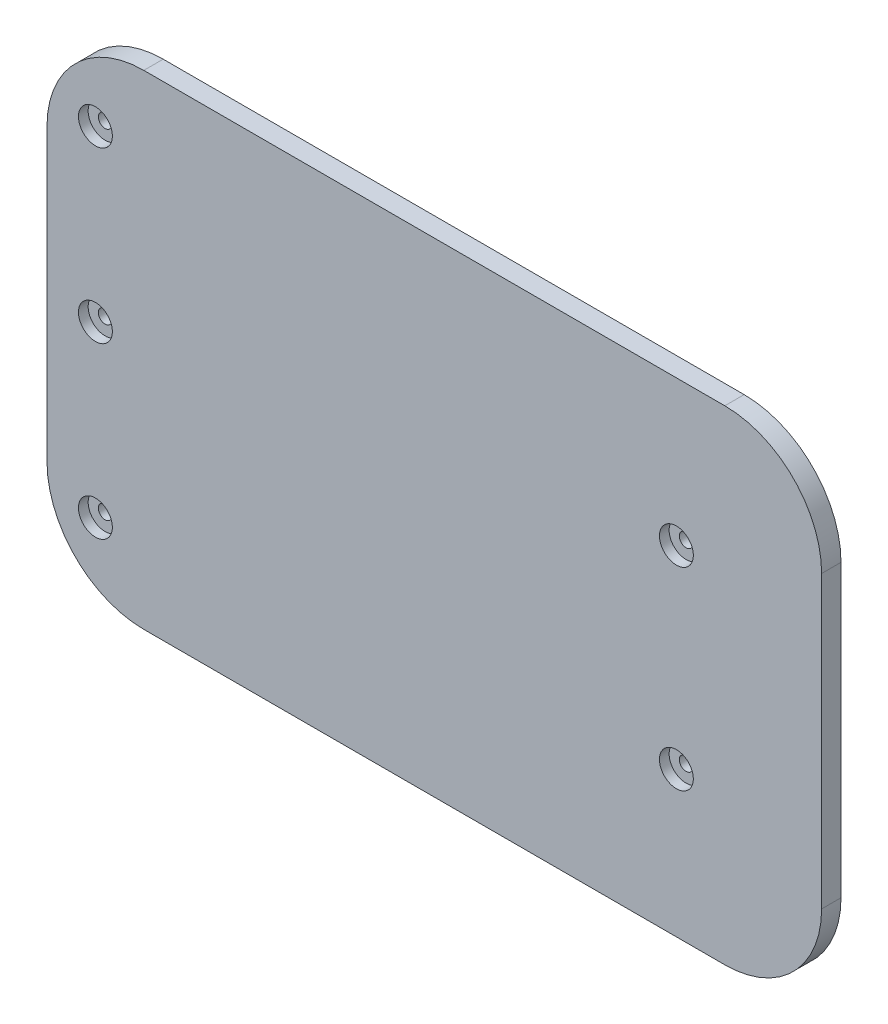
ISO-10303-21;
HEADER;
FILE_DESCRIPTION(('STEP AP214'),'2;1');
FILE_NAME('part.step','',(''),(''),'','','');
FILE_SCHEMA(('AUTOMOTIVE_DESIGN { 1 0 10303 214 1 1 1 1 }'));
ENDSEC;
DATA;
#1=APPLICATION_CONTEXT('core data for automotive mechanical design processes');
#2=APPLICATION_PROTOCOL_DEFINITION('international standard','automotive_design',2000,#1);
#3=PRODUCT_CONTEXT('',#1,'mechanical');
#4=PRODUCT('Part','Part','',(#3));
#5=PRODUCT_RELATED_PRODUCT_CATEGORY('part','',(#4));
#6=PRODUCT_DEFINITION_FORMATION('','',#4);
#7=PRODUCT_DEFINITION_CONTEXT('part definition',#1,'design');
#8=PRODUCT_DEFINITION('design','',#6,#7);
#9=PRODUCT_DEFINITION_SHAPE('','',#8);
#10=(LENGTH_UNIT() NAMED_UNIT(*) SI_UNIT(.MILLI.,.METRE.));
#11=(NAMED_UNIT(*) PLANE_ANGLE_UNIT() SI_UNIT($,.RADIAN.));
#12=(NAMED_UNIT(*) SI_UNIT($,.STERADIAN.) SOLID_ANGLE_UNIT());
#13=UNCERTAINTY_MEASURE_WITH_UNIT(LENGTH_MEASURE(1.E-05),#10,'distance_accuracy_value','');
#14=(GEOMETRIC_REPRESENTATION_CONTEXT(3) GLOBAL_UNCERTAINTY_ASSIGNED_CONTEXT((#13)) GLOBAL_UNIT_ASSIGNED_CONTEXT((#10,
#11,#12)) REPRESENTATION_CONTEXT('',''));
#15=CARTESIAN_POINT('',(0.,0.,0.));
#16=DIRECTION('',(0.,0.,1.));
#17=DIRECTION('',(1.,0.,0.));
#18=AXIS2_PLACEMENT_3D('',#15,#16,#17);
#19=CARTESIAN_POINT('',(130.,30.,0.));
#20=DIRECTION('',(0.,0.,1.));
#21=DIRECTION('',(1.,0.,0.));
#22=AXIS2_PLACEMENT_3D('',#19,#20,#21);
#23=CYLINDRICAL_SURFACE('',#22,1.4);
#24=CARTESIAN_POINT('',(130.,30.,0.));
#25=DIRECTION('',(0.,0.,1.));
#26=DIRECTION('',(1.,0.,0.));
#27=AXIS2_PLACEMENT_3D('',#24,#25,#26);
#28=CIRCLE('',#27,1.4);
#29=CARTESIAN_POINT('',(131.4,30.,0.));
#30=VERTEX_POINT('',#29);
#31=EDGE_CURVE('E133',#30,#30,#28,.T.);
#32=ORIENTED_EDGE('',*,*,#31,.F.);
#33=EDGE_LOOP('',(#32));
#34=FACE_BOUND('',#33,.T.);
#35=CARTESIAN_POINT('',(130.,30.,2.));
#36=DIRECTION('',(0.,0.,1.));
#37=DIRECTION('',(1.,0.,0.));
#38=AXIS2_PLACEMENT_3D('',#35,#36,#37);
#39=CIRCLE('',#38,1.4);
#40=CARTESIAN_POINT('',(131.4,30.,2.));
#41=VERTEX_POINT('',#40);
#42=EDGE_CURVE('E37',#41,#41,#39,.F.);
#43=ORIENTED_EDGE('',*,*,#42,.F.);
#44=EDGE_LOOP('',(#43));
#45=FACE_BOUND('',#44,.T.);
#46=ADVANCED_FACE('F33',(#34,#45),#23,.F.);
#47=CARTESIAN_POINT('',(10.,85.,0.));
#48=DIRECTION('',(0.,0.,1.));
#49=DIRECTION('',(1.,0.,0.));
#50=AXIS2_PLACEMENT_3D('',#47,#48,#49);
#51=CYLINDRICAL_SURFACE('',#50,1.4);
#52=CARTESIAN_POINT('',(10.,85.,0.));
#53=DIRECTION('',(0.,0.,1.));
#54=DIRECTION('',(1.,0.,0.));
#55=AXIS2_PLACEMENT_3D('',#52,#53,#54);
#56=CIRCLE('',#55,1.4);
#57=CARTESIAN_POINT('',(11.4,85.,0.));
#58=VERTEX_POINT('',#57);
#59=EDGE_CURVE('E175',#58,#58,#56,.T.);
#60=ORIENTED_EDGE('',*,*,#59,.F.);
#61=EDGE_LOOP('',(#60));
#62=FACE_BOUND('',#61,.T.);
#63=CARTESIAN_POINT('',(10.,85.,2.));
#64=DIRECTION('',(0.,0.,1.));
#65=DIRECTION('',(1.,0.,0.));
#66=AXIS2_PLACEMENT_3D('',#63,#64,#65);
#67=CIRCLE('',#66,1.4);
#68=CARTESIAN_POINT('',(11.4,85.,2.));
#69=VERTEX_POINT('',#68);
#70=EDGE_CURVE('E170',#69,#69,#67,.F.);
#71=ORIENTED_EDGE('',*,*,#70,.F.);
#72=EDGE_LOOP('',(#71));
#73=FACE_BOUND('',#72,.T.);
#74=ADVANCED_FACE('F227',(#62,#73),#51,.F.);
#75=CARTESIAN_POINT('',(10.,50.,0.));
#76=DIRECTION('',(0.,0.,1.));
#77=DIRECTION('',(1.,0.,0.));
#78=AXIS2_PLACEMENT_3D('',#75,#76,#77);
#79=CYLINDRICAL_SURFACE('',#78,1.4);
#80=CARTESIAN_POINT('',(10.,50.,0.));
#81=DIRECTION('',(0.,0.,1.));
#82=DIRECTION('',(1.,0.,0.));
#83=AXIS2_PLACEMENT_3D('',#80,#81,#82);
#84=CIRCLE('',#83,1.4);
#85=CARTESIAN_POINT('',(11.4,50.,0.));
#86=VERTEX_POINT('',#85);
#87=EDGE_CURVE('E179',#86,#86,#84,.T.);
#88=ORIENTED_EDGE('',*,*,#87,.F.);
#89=EDGE_LOOP('',(#88));
#90=FACE_BOUND('',#89,.T.);
#91=CARTESIAN_POINT('',(10.,50.,2.));
#92=DIRECTION('',(0.,0.,1.));
#93=DIRECTION('',(1.,0.,0.));
#94=AXIS2_PLACEMENT_3D('',#91,#92,#93);
#95=CIRCLE('',#94,1.4);
#96=CARTESIAN_POINT('',(11.4,50.,2.));
#97=VERTEX_POINT('',#96);
#98=EDGE_CURVE('E168',#97,#97,#95,.F.);
#99=ORIENTED_EDGE('',*,*,#98,.F.);
#100=EDGE_LOOP('',(#99));
#101=FACE_BOUND('',#100,.T.);
#102=ADVANCED_FACE('F233',(#90,#101),#79,.F.);
#103=CARTESIAN_POINT('',(10.,15.,0.));
#104=DIRECTION('',(0.,0.,1.));
#105=DIRECTION('',(1.,0.,0.));
#106=AXIS2_PLACEMENT_3D('',#103,#104,#105);
#107=CYLINDRICAL_SURFACE('',#106,1.4);
#108=CARTESIAN_POINT('',(10.,15.,0.));
#109=DIRECTION('',(0.,0.,1.));
#110=DIRECTION('',(1.,0.,0.));
#111=AXIS2_PLACEMENT_3D('',#108,#109,#110);
#112=CIRCLE('',#111,1.4);
#113=CARTESIAN_POINT('',(11.4,15.,0.));
#114=VERTEX_POINT('',#113);
#115=EDGE_CURVE('E184',#114,#114,#112,.T.);
#116=ORIENTED_EDGE('',*,*,#115,.F.);
#117=EDGE_LOOP('',(#116));
#118=FACE_BOUND('',#117,.T.);
#119=CARTESIAN_POINT('',(10.,15.,2.));
#120=DIRECTION('',(0.,0.,1.));
#121=DIRECTION('',(1.,0.,0.));
#122=AXIS2_PLACEMENT_3D('',#119,#120,#121);
#123=CIRCLE('',#122,1.4);
#124=CARTESIAN_POINT('',(11.4,15.,2.));
#125=VERTEX_POINT('',#124);
#126=EDGE_CURVE('E164',#125,#125,#123,.F.);
#127=ORIENTED_EDGE('',*,*,#126,.F.);
#128=EDGE_LOOP('',(#127));
#129=FACE_BOUND('',#128,.T.);
#130=ADVANCED_FACE('F240',(#118,#129),#107,.F.);
#131=CARTESIAN_POINT('',(130.,70.,0.));
#132=DIRECTION('',(0.,0.,1.));
#133=DIRECTION('',(1.,0.,0.));
#134=AXIS2_PLACEMENT_3D('',#131,#132,#133);
#135=CYLINDRICAL_SURFACE('',#134,1.4);
#136=CARTESIAN_POINT('',(130.,70.,0.));
#137=DIRECTION('',(0.,0.,1.));
#138=DIRECTION('',(1.,0.,0.));
#139=AXIS2_PLACEMENT_3D('',#136,#137,#138);
#140=CIRCLE('',#139,1.4);
#141=CARTESIAN_POINT('',(131.4,70.,0.));
#142=VERTEX_POINT('',#141);
#143=EDGE_CURVE('E188',#142,#142,#140,.T.);
#144=ORIENTED_EDGE('',*,*,#143,.F.);
#145=EDGE_LOOP('',(#144));
#146=FACE_BOUND('',#145,.T.);
#147=CARTESIAN_POINT('',(130.,70.,2.));
#148=DIRECTION('',(0.,0.,1.));
#149=DIRECTION('',(1.,0.,0.));
#150=AXIS2_PLACEMENT_3D('',#147,#148,#149);
#151=CIRCLE('',#150,1.4);
#152=CARTESIAN_POINT('',(131.4,70.,2.));
#153=VERTEX_POINT('',#152);
#154=EDGE_CURVE('E161',#153,#153,#151,.F.);
#155=ORIENTED_EDGE('',*,*,#154,.F.);
#156=EDGE_LOOP('',(#155));
#157=FACE_BOUND('',#156,.T.);
#158=ADVANCED_FACE('F255',(#146,#157),#135,.F.);
#159=CARTESIAN_POINT('',(0.,0.,4.));
#160=DIRECTION('',(1.,0.,0.));
#161=DIRECTION('',(0.,0.,-1.));
#162=AXIS2_PLACEMENT_3D('',#159,#160,#161);
#163=PLANE('',#162);
#164=DIRECTION('',(0.,-1.,0.));
#165=VECTOR('',#164,1.);
#166=CARTESIAN_POINT('',(0.,0.,0.));
#167=LINE('',#166,#165);
#168=CARTESIAN_POINT('',(0.,80.,0.));
#169=VERTEX_POINT('',#168);
#170=CARTESIAN_POINT('',(0.,20.,0.));
#171=VERTEX_POINT('',#170);
#172=EDGE_CURVE('E128',#169,#171,#167,.T.);
#173=ORIENTED_EDGE('',*,*,#172,.T.);
#174=DIRECTION('',(0.,0.,-1.));
#175=VECTOR('',#174,1.);
#176=CARTESIAN_POINT('',(0.,20.,4.));
#177=LINE('',#176,#175);
#178=CARTESIAN_POINT('',(0.,20.,4.));
#179=VERTEX_POINT('',#178);
#180=EDGE_CURVE('E106',#171,#179,#177,.F.);
#181=ORIENTED_EDGE('',*,*,#180,.T.);
#182=DIRECTION('',(0.,-1.,0.));
#183=VECTOR('',#182,1.);
#184=CARTESIAN_POINT('',(0.,0.,4.));
#185=LINE('',#184,#183);
#186=CARTESIAN_POINT('',(0.,80.,4.));
#187=VERTEX_POINT('',#186);
#188=EDGE_CURVE('E138',#187,#179,#185,.T.);
#189=ORIENTED_EDGE('',*,*,#188,.F.);
#190=DIRECTION('',(0.,0.,-1.));
#191=VECTOR('',#190,1.);
#192=CARTESIAN_POINT('',(0.,80.,4.));
#193=LINE('',#192,#191);
#194=EDGE_CURVE('E111',#187,#169,#193,.T.);
#195=ORIENTED_EDGE('',*,*,#194,.T.);
#196=EDGE_LOOP('',(#173,#181,#189,#195));
#197=FACE_BOUND('',#196,.T.);
#198=ADVANCED_FACE('F206',(#197),#163,.F.);
#199=CARTESIAN_POINT('',(0.,0.,4.));
#200=DIRECTION('',(0.,1.,0.));
#201=DIRECTION('',(0.,0.,1.));
#202=AXIS2_PLACEMENT_3D('',#199,#200,#201);
#203=PLANE('',#202);
#204=DIRECTION('',(1.,0.,0.));
#205=VECTOR('',#204,1.);
#206=CARTESIAN_POINT('',(0.,0.,4.));
#207=LINE('',#206,#205);
#208=CARTESIAN_POINT('',(20.,0.,4.));
#209=VERTEX_POINT('',#208);
#210=CARTESIAN_POINT('',(140.,0.,4.));
#211=VERTEX_POINT('',#210);
#212=EDGE_CURVE('E121',#209,#211,#207,.T.);
#213=ORIENTED_EDGE('',*,*,#212,.F.);
#214=DIRECTION('',(0.,0.,-1.));
#215=VECTOR('',#214,1.);
#216=CARTESIAN_POINT('',(20.,0.,4.));
#217=LINE('',#216,#215);
#218=CARTESIAN_POINT('',(20.,0.,0.));
#219=VERTEX_POINT('',#218);
#220=EDGE_CURVE('E105',#209,#219,#217,.T.);
#221=ORIENTED_EDGE('',*,*,#220,.T.);
#222=DIRECTION('',(1.,0.,0.));
#223=VECTOR('',#222,1.);
#224=CARTESIAN_POINT('',(0.,0.,0.));
#225=LINE('',#224,#223);
#226=CARTESIAN_POINT('',(140.,0.,0.));
#227=VERTEX_POINT('',#226);
#228=EDGE_CURVE('E118',#219,#227,#225,.T.);
#229=ORIENTED_EDGE('',*,*,#228,.T.);
#230=DIRECTION('',(0.,0.,-1.));
#231=VECTOR('',#230,1.);
#232=CARTESIAN_POINT('',(140.,0.,4.));
#233=LINE('',#232,#231);
#234=EDGE_CURVE('E123',#227,#211,#233,.F.);
#235=ORIENTED_EDGE('',*,*,#234,.T.);
#236=EDGE_LOOP('',(#213,#221,#229,#235));
#237=FACE_BOUND('',#236,.T.);
#238=ADVANCED_FACE('F117',(#237),#203,.F.);
#239=CARTESIAN_POINT('',(160.,0.,4.));
#240=DIRECTION('',(-1.,0.,0.));
#241=DIRECTION('',(0.,0.,1.));
#242=AXIS2_PLACEMENT_3D('',#239,#240,#241);
#243=PLANE('',#242);
#244=DIRECTION('',(0.,1.,0.));
#245=VECTOR('',#244,1.);
#246=CARTESIAN_POINT('',(160.,0.,4.));
#247=LINE('',#246,#245);
#248=CARTESIAN_POINT('',(160.,20.,4.));
#249=VERTEX_POINT('',#248);
#250=CARTESIAN_POINT('',(160.,80.,4.));
#251=VERTEX_POINT('',#250);
#252=EDGE_CURVE('E198',#249,#251,#247,.T.);
#253=ORIENTED_EDGE('',*,*,#252,.F.);
#254=DIRECTION('',(0.,0.,-1.));
#255=VECTOR('',#254,1.);
#256=CARTESIAN_POINT('',(160.,20.,4.));
#257=LINE('',#256,#255);
#258=CARTESIAN_POINT('',(160.,20.,0.));
#259=VERTEX_POINT('',#258);
#260=EDGE_CURVE('E157',#249,#259,#257,.T.);
#261=ORIENTED_EDGE('',*,*,#260,.T.);
#262=DIRECTION('',(0.,1.,0.));
#263=VECTOR('',#262,1.);
#264=CARTESIAN_POINT('',(160.,0.,0.));
#265=LINE('',#264,#263);
#266=CARTESIAN_POINT('',(160.,80.,0.));
#267=VERTEX_POINT('',#266);
#268=EDGE_CURVE('E127',#259,#267,#265,.T.);
#269=ORIENTED_EDGE('',*,*,#268,.T.);
#270=DIRECTION('',(0.,0.,-1.));
#271=VECTOR('',#270,1.);
#272=CARTESIAN_POINT('',(160.,80.,4.));
#273=LINE('',#272,#271);
#274=EDGE_CURVE('E155',#267,#251,#273,.F.);
#275=ORIENTED_EDGE('',*,*,#274,.T.);
#276=EDGE_LOOP('',(#253,#261,#269,#275));
#277=FACE_BOUND('',#276,.T.);
#278=ADVANCED_FACE('F214',(#277),#243,.F.);
#279=CARTESIAN_POINT('',(0.,100.,4.));
#280=DIRECTION('',(0.,-1.,0.));
#281=DIRECTION('',(0.,0.,-1.));
#282=AXIS2_PLACEMENT_3D('',#279,#280,#281);
#283=PLANE('',#282);
#284=DIRECTION('',(-1.,0.,0.));
#285=VECTOR('',#284,1.);
#286=CARTESIAN_POINT('',(0.,100.,4.));
#287=LINE('',#286,#285);
#288=CARTESIAN_POINT('',(140.,100.,4.));
#289=VERTEX_POINT('',#288);
#290=CARTESIAN_POINT('',(20.,100.,4.));
#291=VERTEX_POINT('',#290);
#292=EDGE_CURVE('E139',#289,#291,#287,.T.);
#293=ORIENTED_EDGE('',*,*,#292,.F.);
#294=DIRECTION('',(0.,0.,-1.));
#295=VECTOR('',#294,1.);
#296=CARTESIAN_POINT('',(140.,100.,4.));
#297=LINE('',#296,#295);
#298=CARTESIAN_POINT('',(140.,100.,0.));
#299=VERTEX_POINT('',#298);
#300=EDGE_CURVE('E11',#289,#299,#297,.T.);
#301=ORIENTED_EDGE('',*,*,#300,.T.);
#302=DIRECTION('',(-1.,0.,0.));
#303=VECTOR('',#302,1.);
#304=CARTESIAN_POINT('',(0.,100.,0.));
#305=LINE('',#304,#303);
#306=CARTESIAN_POINT('',(20.,100.,0.));
#307=VERTEX_POINT('',#306);
#308=EDGE_CURVE('E131',#299,#307,#305,.T.);
#309=ORIENTED_EDGE('',*,*,#308,.T.);
#310=DIRECTION('',(0.,0.,-1.));
#311=VECTOR('',#310,1.);
#312=CARTESIAN_POINT('',(20.,100.,4.));
#313=LINE('',#312,#311);
#314=EDGE_CURVE('E42',#307,#291,#313,.F.);
#315=ORIENTED_EDGE('',*,*,#314,.T.);
#316=EDGE_LOOP('',(#293,#301,#309,#315));
#317=FACE_BOUND('',#316,.T.);
#318=ADVANCED_FACE('F208',(#317),#283,.F.);
#319=CARTESIAN_POINT('',(0.,0.,4.));
#320=DIRECTION('',(0.,0.,-1.));
#321=DIRECTION('',(-1.,0.,0.));
#322=AXIS2_PLACEMENT_3D('',#319,#320,#321);
#323=PLANE('',#322);
#324=CARTESIAN_POINT('',(10.,15.,4.));
#325=DIRECTION('',(0.,0.,1.));
#326=DIRECTION('',(1.,0.,0.));
#327=AXIS2_PLACEMENT_3D('',#324,#325,#326);
#328=CIRCLE('',#327,3.5);
#329=CARTESIAN_POINT('',(13.5,15.,4.));
#330=VERTEX_POINT('',#329);
#331=EDGE_CURVE('E339',#330,#330,#328,.T.);
#332=ORIENTED_EDGE('',*,*,#331,.F.);
#333=EDGE_LOOP('',(#332));
#334=FACE_BOUND('',#333,.T.);
#335=CARTESIAN_POINT('',(10.,50.,4.));
#336=DIRECTION('',(0.,0.,1.));
#337=DIRECTION('',(1.,0.,0.));
#338=AXIS2_PLACEMENT_3D('',#335,#336,#337);
#339=CIRCLE('',#338,3.5);
#340=CARTESIAN_POINT('',(13.5,50.,4.));
#341=VERTEX_POINT('',#340);
#342=EDGE_CURVE('E333',#341,#341,#339,.T.);
#343=ORIENTED_EDGE('',*,*,#342,.F.);
#344=EDGE_LOOP('',(#343));
#345=FACE_BOUND('',#344,.T.);
#346=CARTESIAN_POINT('',(10.,85.,4.));
#347=DIRECTION('',(0.,0.,1.));
#348=DIRECTION('',(1.,0.,0.));
#349=AXIS2_PLACEMENT_3D('',#346,#347,#348);
#350=CIRCLE('',#349,3.5);
#351=CARTESIAN_POINT('',(13.5,85.,4.));
#352=VERTEX_POINT('',#351);
#353=EDGE_CURVE('E327',#352,#352,#350,.T.);
#354=ORIENTED_EDGE('',*,*,#353,.F.);
#355=EDGE_LOOP('',(#354));
#356=FACE_BOUND('',#355,.T.);
#357=CARTESIAN_POINT('',(130.,70.,4.));
#358=DIRECTION('',(0.,0.,1.));
#359=DIRECTION('',(1.,0.,0.));
#360=AXIS2_PLACEMENT_3D('',#357,#358,#359);
#361=CIRCLE('',#360,3.49999999999999);
#362=CARTESIAN_POINT('',(133.5,70.,4.));
#363=VERTEX_POINT('',#362);
#364=EDGE_CURVE('E318',#363,#363,#361,.T.);
#365=ORIENTED_EDGE('',*,*,#364,.F.);
#366=EDGE_LOOP('',(#365));
#367=FACE_BOUND('',#366,.T.);
#368=CARTESIAN_POINT('',(130.,30.,4.));
#369=DIRECTION('',(0.,0.,1.));
#370=DIRECTION('',(1.,0.,0.));
#371=AXIS2_PLACEMENT_3D('',#368,#369,#370);
#372=CIRCLE('',#371,3.49999999999999);
#373=CARTESIAN_POINT('',(133.5,30.,4.));
#374=VERTEX_POINT('',#373);
#375=EDGE_CURVE('E317',#374,#374,#372,.T.);
#376=ORIENTED_EDGE('',*,*,#375,.F.);
#377=EDGE_LOOP('',(#376));
#378=FACE_BOUND('',#377,.T.);
#379=ORIENTED_EDGE('',*,*,#188,.T.);
#380=CARTESIAN_POINT('',(20.,20.,4.));
#381=DIRECTION('',(0.,0.,-1.));
#382=DIRECTION('',(-1.,0.,0.));
#383=AXIS2_PLACEMENT_3D('',#380,#381,#382);
#384=CIRCLE('',#383,20.);
#385=EDGE_CURVE('E153',#179,#209,#384,.F.);
#386=ORIENTED_EDGE('',*,*,#385,.T.);
#387=ORIENTED_EDGE('',*,*,#212,.T.);
#388=CARTESIAN_POINT('',(140.,20.,4.));
#389=DIRECTION('',(0.,0.,-1.));
#390=DIRECTION('',(-1.,0.,0.));
#391=AXIS2_PLACEMENT_3D('',#388,#389,#390);
#392=CIRCLE('',#391,20.);
#393=EDGE_CURVE('E151',#211,#249,#392,.F.);
#394=ORIENTED_EDGE('',*,*,#393,.T.);
#395=ORIENTED_EDGE('',*,*,#252,.T.);
#396=CARTESIAN_POINT('',(140.,80.,4.));
#397=DIRECTION('',(0.,0.,-1.));
#398=DIRECTION('',(-1.,0.,0.));
#399=AXIS2_PLACEMENT_3D('',#396,#397,#398);
#400=CIRCLE('',#399,20.);
#401=EDGE_CURVE('E56',#251,#289,#400,.F.);
#402=ORIENTED_EDGE('',*,*,#401,.T.);
#403=ORIENTED_EDGE('',*,*,#292,.T.);
#404=CARTESIAN_POINT('',(20.,80.,4.));
#405=DIRECTION('',(0.,0.,-1.));
#406=DIRECTION('',(-1.,0.,0.));
#407=AXIS2_PLACEMENT_3D('',#404,#405,#406);
#408=CIRCLE('',#407,20.);
#409=EDGE_CURVE('E148',#291,#187,#408,.F.);
#410=ORIENTED_EDGE('',*,*,#409,.T.);
#411=EDGE_LOOP('',(#379,#386,#387,#394,#395,#402,#403,#410));
#412=FACE_BOUND('',#411,.T.);
#413=ADVANCED_FACE('F200',(#334,#345,#356,#367,#378,#412),#323,.F.);
#414=CARTESIAN_POINT('',(0.,0.,0.));
#415=DIRECTION('',(0.,0.,-1.));
#416=DIRECTION('',(-1.,0.,0.));
#417=AXIS2_PLACEMENT_3D('',#414,#415,#416);
#418=PLANE('',#417);
#419=ORIENTED_EDGE('',*,*,#143,.T.);
#420=EDGE_LOOP('',(#419));
#421=FACE_BOUND('',#420,.T.);
#422=ORIENTED_EDGE('',*,*,#115,.T.);
#423=EDGE_LOOP('',(#422));
#424=FACE_BOUND('',#423,.T.);
#425=ORIENTED_EDGE('',*,*,#87,.T.);
#426=EDGE_LOOP('',(#425));
#427=FACE_BOUND('',#426,.T.);
#428=ORIENTED_EDGE('',*,*,#59,.T.);
#429=EDGE_LOOP('',(#428));
#430=FACE_BOUND('',#429,.T.);
#431=ORIENTED_EDGE('',*,*,#31,.T.);
#432=EDGE_LOOP('',(#431));
#433=FACE_BOUND('',#432,.T.);
#434=ORIENTED_EDGE('',*,*,#228,.F.);
#435=CARTESIAN_POINT('',(20.,20.,0.));
#436=DIRECTION('',(0.,0.,-1.));
#437=DIRECTION('',(-1.,0.,0.));
#438=AXIS2_PLACEMENT_3D('',#435,#436,#437);
#439=CIRCLE('',#438,20.);
#440=EDGE_CURVE('E101',#219,#171,#439,.T.);
#441=ORIENTED_EDGE('',*,*,#440,.T.);
#442=ORIENTED_EDGE('',*,*,#172,.F.);
#443=CARTESIAN_POINT('',(20.,80.,0.));
#444=DIRECTION('',(0.,0.,-1.));
#445=DIRECTION('',(-1.,0.,0.));
#446=AXIS2_PLACEMENT_3D('',#443,#444,#445);
#447=CIRCLE('',#446,20.);
#448=EDGE_CURVE('E122',#169,#307,#447,.T.);
#449=ORIENTED_EDGE('',*,*,#448,.T.);
#450=ORIENTED_EDGE('',*,*,#308,.F.);
#451=CARTESIAN_POINT('',(140.,80.,0.));
#452=DIRECTION('',(0.,0.,-1.));
#453=DIRECTION('',(-1.,0.,0.));
#454=AXIS2_PLACEMENT_3D('',#451,#452,#453);
#455=CIRCLE('',#454,20.);
#456=EDGE_CURVE('E142',#299,#267,#455,.T.);
#457=ORIENTED_EDGE('',*,*,#456,.T.);
#458=ORIENTED_EDGE('',*,*,#268,.F.);
#459=CARTESIAN_POINT('',(140.,20.,0.));
#460=DIRECTION('',(0.,0.,-1.));
#461=DIRECTION('',(-1.,0.,0.));
#462=AXIS2_PLACEMENT_3D('',#459,#460,#461);
#463=CIRCLE('',#462,20.);
#464=EDGE_CURVE('E112',#259,#227,#463,.T.);
#465=ORIENTED_EDGE('',*,*,#464,.T.);
#466=EDGE_LOOP('',(#434,#441,#442,#449,#450,#457,#458,#465));
#467=FACE_BOUND('',#466,.T.);
#468=ADVANCED_FACE('F125',(#421,#424,#427,#430,#433,#467),#418,.T.);
#469=CARTESIAN_POINT('',(20.,20.,4.));
#470=DIRECTION('',(0.,0.,-1.));
#471=DIRECTION('',(-1.,0.,0.));
#472=AXIS2_PLACEMENT_3D('',#469,#470,#471);
#473=CYLINDRICAL_SURFACE('',#472,20.);
#474=ORIENTED_EDGE('',*,*,#385,.F.);
#475=ORIENTED_EDGE('',*,*,#180,.F.);
#476=ORIENTED_EDGE('',*,*,#440,.F.);
#477=ORIENTED_EDGE('',*,*,#220,.F.);
#478=EDGE_LOOP('',(#474,#475,#476,#477));
#479=FACE_BOUND('',#478,.T.);
#480=ADVANCED_FACE('F104',(#479),#473,.T.);
#481=CARTESIAN_POINT('',(140.,20.,4.));
#482=DIRECTION('',(0.,0.,-1.));
#483=DIRECTION('',(-1.,0.,0.));
#484=AXIS2_PLACEMENT_3D('',#481,#482,#483);
#485=CYLINDRICAL_SURFACE('',#484,20.);
#486=ORIENTED_EDGE('',*,*,#393,.F.);
#487=ORIENTED_EDGE('',*,*,#234,.F.);
#488=ORIENTED_EDGE('',*,*,#464,.F.);
#489=ORIENTED_EDGE('',*,*,#260,.F.);
#490=EDGE_LOOP('',(#486,#487,#488,#489));
#491=FACE_BOUND('',#490,.T.);
#492=ADVANCED_FACE('F218',(#491),#485,.T.);
#493=CARTESIAN_POINT('',(140.,80.,4.));
#494=DIRECTION('',(0.,0.,-1.));
#495=DIRECTION('',(-1.,0.,0.));
#496=AXIS2_PLACEMENT_3D('',#493,#494,#495);
#497=CYLINDRICAL_SURFACE('',#496,20.);
#498=ORIENTED_EDGE('',*,*,#401,.F.);
#499=ORIENTED_EDGE('',*,*,#274,.F.);
#500=ORIENTED_EDGE('',*,*,#456,.F.);
#501=ORIENTED_EDGE('',*,*,#300,.F.);
#502=EDGE_LOOP('',(#498,#499,#500,#501));
#503=FACE_BOUND('',#502,.T.);
#504=ADVANCED_FACE('F210',(#503),#497,.T.);
#505=CARTESIAN_POINT('',(20.,80.,4.));
#506=DIRECTION('',(0.,0.,-1.));
#507=DIRECTION('',(-1.,0.,0.));
#508=AXIS2_PLACEMENT_3D('',#505,#506,#507);
#509=CYLINDRICAL_SURFACE('',#508,20.);
#510=ORIENTED_EDGE('',*,*,#409,.F.);
#511=ORIENTED_EDGE('',*,*,#314,.F.);
#512=ORIENTED_EDGE('',*,*,#448,.F.);
#513=ORIENTED_EDGE('',*,*,#194,.F.);
#514=EDGE_LOOP('',(#510,#511,#512,#513));
#515=FACE_BOUND('',#514,.T.);
#516=ADVANCED_FACE('F35',(#515),#509,.T.);
#517=CARTESIAN_POINT('',(130.,70.,2.));
#518=DIRECTION('',(0.,0.,1.));
#519=DIRECTION('',(1.,0.,0.));
#520=AXIS2_PLACEMENT_3D('',#517,#518,#519);
#521=PLANE('',#520);
#522=CARTESIAN_POINT('',(130.,70.,2.));
#523=DIRECTION('',(0.,0.,1.));
#524=DIRECTION('',(1.,0.,0.));
#525=AXIS2_PLACEMENT_3D('',#522,#523,#524);
#526=CIRCLE('',#525,3.49999999999999);
#527=CARTESIAN_POINT('',(133.5,70.,2.));
#528=VERTEX_POINT('',#527);
#529=EDGE_CURVE('E315',#528,#528,#526,.T.);
#530=ORIENTED_EDGE('',*,*,#529,.T.);
#531=EDGE_LOOP('',(#530));
#532=FACE_BOUND('',#531,.T.);
#533=ORIENTED_EDGE('',*,*,#154,.T.);
#534=EDGE_LOOP('',(#533));
#535=FACE_BOUND('',#534,.T.);
#536=ADVANCED_FACE('F305',(#532,#535),#521,.T.);
#537=CARTESIAN_POINT('',(130.,70.,2.));
#538=DIRECTION('',(0.,0.,1.));
#539=DIRECTION('',(1.,0.,0.));
#540=AXIS2_PLACEMENT_3D('',#537,#538,#539);
#541=CYLINDRICAL_SURFACE('',#540,3.49999999999999);
#542=ORIENTED_EDGE('',*,*,#529,.F.);
#543=EDGE_LOOP('',(#542));
#544=FACE_BOUND('',#543,.T.);
#545=ORIENTED_EDGE('',*,*,#364,.T.);
#546=EDGE_LOOP('',(#545));
#547=FACE_BOUND('',#546,.T.);
#548=ADVANCED_FACE('F287',(#544,#547),#541,.F.);
#549=CARTESIAN_POINT('',(10.,15.,2.));
#550=DIRECTION('',(0.,0.,1.));
#551=DIRECTION('',(1.,0.,0.));
#552=AXIS2_PLACEMENT_3D('',#549,#550,#551);
#553=PLANE('',#552);
#554=CARTESIAN_POINT('',(10.,15.,2.));
#555=DIRECTION('',(0.,0.,1.));
#556=DIRECTION('',(1.,0.,0.));
#557=AXIS2_PLACEMENT_3D('',#554,#555,#556);
#558=CIRCLE('',#557,3.5);
#559=CARTESIAN_POINT('',(13.5,15.,2.));
#560=VERTEX_POINT('',#559);
#561=EDGE_CURVE('E336',#560,#560,#558,.T.);
#562=ORIENTED_EDGE('',*,*,#561,.T.);
#563=EDGE_LOOP('',(#562));
#564=FACE_BOUND('',#563,.T.);
#565=ORIENTED_EDGE('',*,*,#126,.T.);
#566=EDGE_LOOP('',(#565));
#567=FACE_BOUND('',#566,.T.);
#568=ADVANCED_FACE('F283',(#564,#567),#553,.T.);
#569=CARTESIAN_POINT('',(10.,15.,2.));
#570=DIRECTION('',(0.,0.,1.));
#571=DIRECTION('',(1.,0.,0.));
#572=AXIS2_PLACEMENT_3D('',#569,#570,#571);
#573=CYLINDRICAL_SURFACE('',#572,3.5);
#574=ORIENTED_EDGE('',*,*,#561,.F.);
#575=EDGE_LOOP('',(#574));
#576=FACE_BOUND('',#575,.T.);
#577=ORIENTED_EDGE('',*,*,#331,.T.);
#578=EDGE_LOOP('',(#577));
#579=FACE_BOUND('',#578,.T.);
#580=ADVANCED_FACE('F279',(#576,#579),#573,.F.);
#581=CARTESIAN_POINT('',(10.,50.,2.));
#582=DIRECTION('',(0.,0.,1.));
#583=DIRECTION('',(1.,0.,0.));
#584=AXIS2_PLACEMENT_3D('',#581,#582,#583);
#585=PLANE('',#584);
#586=CARTESIAN_POINT('',(10.,50.,2.));
#587=DIRECTION('',(0.,0.,1.));
#588=DIRECTION('',(1.,0.,0.));
#589=AXIS2_PLACEMENT_3D('',#586,#587,#588);
#590=CIRCLE('',#589,3.5);
#591=CARTESIAN_POINT('',(13.5,50.,2.));
#592=VERTEX_POINT('',#591);
#593=EDGE_CURVE('E330',#592,#592,#590,.T.);
#594=ORIENTED_EDGE('',*,*,#593,.T.);
#595=EDGE_LOOP('',(#594));
#596=FACE_BOUND('',#595,.T.);
#597=ORIENTED_EDGE('',*,*,#98,.T.);
#598=EDGE_LOOP('',(#597));
#599=FACE_BOUND('',#598,.T.);
#600=ADVANCED_FACE('F282',(#596,#599),#585,.T.);
#601=CARTESIAN_POINT('',(10.,50.,2.));
#602=DIRECTION('',(0.,0.,1.));
#603=DIRECTION('',(1.,0.,0.));
#604=AXIS2_PLACEMENT_3D('',#601,#602,#603);
#605=CYLINDRICAL_SURFACE('',#604,3.5);
#606=ORIENTED_EDGE('',*,*,#593,.F.);
#607=EDGE_LOOP('',(#606));
#608=FACE_BOUND('',#607,.T.);
#609=ORIENTED_EDGE('',*,*,#342,.T.);
#610=EDGE_LOOP('',(#609));
#611=FACE_BOUND('',#610,.T.);
#612=ADVANCED_FACE('F289',(#608,#611),#605,.F.);
#613=CARTESIAN_POINT('',(10.,85.,2.));
#614=DIRECTION('',(0.,0.,1.));
#615=DIRECTION('',(1.,0.,0.));
#616=AXIS2_PLACEMENT_3D('',#613,#614,#615);
#617=PLANE('',#616);
#618=CARTESIAN_POINT('',(10.,85.,2.));
#619=DIRECTION('',(0.,0.,1.));
#620=DIRECTION('',(1.,0.,0.));
#621=AXIS2_PLACEMENT_3D('',#618,#619,#620);
#622=CIRCLE('',#621,3.5);
#623=CARTESIAN_POINT('',(13.5,85.,2.));
#624=VERTEX_POINT('',#623);
#625=EDGE_CURVE('E322',#624,#624,#622,.T.);
#626=ORIENTED_EDGE('',*,*,#625,.T.);
#627=EDGE_LOOP('',(#626));
#628=FACE_BOUND('',#627,.T.);
#629=ORIENTED_EDGE('',*,*,#70,.T.);
#630=EDGE_LOOP('',(#629));
#631=FACE_BOUND('',#630,.T.);
#632=ADVANCED_FACE('F292',(#628,#631),#617,.T.);
#633=CARTESIAN_POINT('',(10.,85.,2.));
#634=DIRECTION('',(0.,0.,1.));
#635=DIRECTION('',(1.,0.,0.));
#636=AXIS2_PLACEMENT_3D('',#633,#634,#635);
#637=CYLINDRICAL_SURFACE('',#636,3.5);
#638=ORIENTED_EDGE('',*,*,#625,.F.);
#639=EDGE_LOOP('',(#638));
#640=FACE_BOUND('',#639,.T.);
#641=ORIENTED_EDGE('',*,*,#353,.T.);
#642=EDGE_LOOP('',(#641));
#643=FACE_BOUND('',#642,.T.);
#644=ADVANCED_FACE('F277',(#640,#643),#637,.F.);
#645=CARTESIAN_POINT('',(130.,30.,2.));
#646=DIRECTION('',(0.,0.,1.));
#647=DIRECTION('',(1.,0.,0.));
#648=AXIS2_PLACEMENT_3D('',#645,#646,#647);
#649=PLANE('',#648);
#650=CARTESIAN_POINT('',(130.,30.,2.));
#651=DIRECTION('',(0.,0.,1.));
#652=DIRECTION('',(1.,0.,0.));
#653=AXIS2_PLACEMENT_3D('',#650,#651,#652);
#654=CIRCLE('',#653,3.49999999999999);
#655=CARTESIAN_POINT('',(133.5,30.,2.));
#656=VERTEX_POINT('',#655);
#657=EDGE_CURVE('E165',#656,#656,#654,.T.);
#658=ORIENTED_EDGE('',*,*,#657,.T.);
#659=EDGE_LOOP('',(#658));
#660=FACE_BOUND('',#659,.T.);
#661=ORIENTED_EDGE('',*,*,#42,.T.);
#662=EDGE_LOOP('',(#661));
#663=FACE_BOUND('',#662,.T.);
#664=ADVANCED_FACE('F273',(#660,#663),#649,.T.);
#665=CARTESIAN_POINT('',(130.,30.,2.));
#666=DIRECTION('',(0.,0.,1.));
#667=DIRECTION('',(1.,0.,0.));
#668=AXIS2_PLACEMENT_3D('',#665,#666,#667);
#669=CYLINDRICAL_SURFACE('',#668,3.49999999999999);
#670=ORIENTED_EDGE('',*,*,#657,.F.);
#671=EDGE_LOOP('',(#670));
#672=FACE_BOUND('',#671,.T.);
#673=ORIENTED_EDGE('',*,*,#375,.T.);
#674=EDGE_LOOP('',(#673));
#675=FACE_BOUND('',#674,.T.);
#676=ADVANCED_FACE('F270',(#672,#675),#669,.F.);
#677=CLOSED_SHELL('',(#46,#74,#102,#130,#158,#198,#238,#278,#318,#413,#468,#480,#492,#504,#516,
#536,#548,#568,#580,#600,#612,#632,#644,#664,#676));
#678=MANIFOLD_SOLID_BREP('B2',#677);
#679=ADVANCED_BREP_SHAPE_REPRESENTATION('',(#18,#678),#14);
#680=SHAPE_DEFINITION_REPRESENTATION(#9,#679);
ENDSEC;
END-ISO-10303-21;
